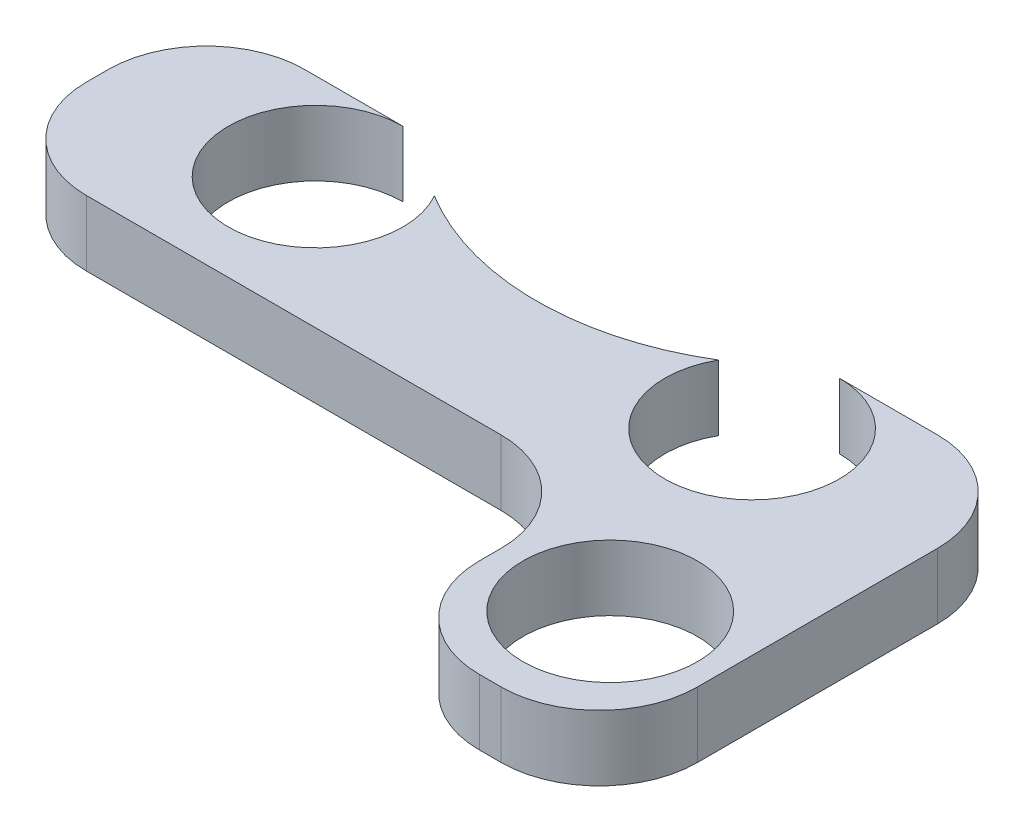
ISO-10303-21;
HEADER;
FILE_DESCRIPTION(('STEP AP214'),'2;1');
FILE_NAME('part.step','',(''),(''),'','','');
FILE_SCHEMA(('AUTOMOTIVE_DESIGN { 1 0 10303 214 1 1 1 1 }'));
ENDSEC;
DATA;
#1=APPLICATION_CONTEXT('core data for automotive mechanical design processes');
#2=APPLICATION_PROTOCOL_DEFINITION('international standard','automotive_design',2000,#1);
#3=PRODUCT_CONTEXT('',#1,'mechanical');
#4=PRODUCT('Part','Part','',(#3));
#5=PRODUCT_RELATED_PRODUCT_CATEGORY('part','',(#4));
#6=PRODUCT_DEFINITION_FORMATION('','',#4);
#7=PRODUCT_DEFINITION_CONTEXT('part definition',#1,'design');
#8=PRODUCT_DEFINITION('design','',#6,#7);
#9=PRODUCT_DEFINITION_SHAPE('','',#8);
#10=(LENGTH_UNIT() NAMED_UNIT(*) SI_UNIT(.MILLI.,.METRE.));
#11=(NAMED_UNIT(*) PLANE_ANGLE_UNIT() SI_UNIT($,.RADIAN.));
#12=(NAMED_UNIT(*) SI_UNIT($,.STERADIAN.) SOLID_ANGLE_UNIT());
#13=UNCERTAINTY_MEASURE_WITH_UNIT(LENGTH_MEASURE(1.E-05),#10,'distance_accuracy_value','');
#14=(GEOMETRIC_REPRESENTATION_CONTEXT(3) GLOBAL_UNCERTAINTY_ASSIGNED_CONTEXT((#13)) GLOBAL_UNIT_ASSIGNED_CONTEXT((#10,
#11,#12)) REPRESENTATION_CONTEXT('',''));
#15=CARTESIAN_POINT('',(0.,0.,0.));
#16=DIRECTION('',(0.,0.,1.));
#17=DIRECTION('',(1.,0.,0.));
#18=AXIS2_PLACEMENT_3D('',#15,#16,#17);
#19=CARTESIAN_POINT('',(-9.99999999999999,1.5,12.6244047484067));
#20=DIRECTION('',(0.,-1.,0.));
#21=DIRECTION('',(0.,0.,-1.));
#22=AXIS2_PLACEMENT_3D('',#19,#20,#21);
#23=PLANE('',#22);
#24=CARTESIAN_POINT('',(-9.99999999999999,1.5,12.6244047484067));
#25=DIRECTION('',(0.,-1.,0.));
#26=DIRECTION('',(0.,0.,-1.));
#27=AXIS2_PLACEMENT_3D('',#24,#25,#26);
#28=CIRCLE('',#27,4.);
#29=CARTESIAN_POINT('',(-6.50911973324603,1.5,10.6715209927295));
#30=VERTEX_POINT('',#29);
#31=CARTESIAN_POINT('',(-9.99999999999999,1.5,8.62440474840669));
#32=VERTEX_POINT('',#31);
#33=EDGE_CURVE('E212',#30,#32,#28,.T.);
#34=ORIENTED_EDGE('',*,*,#33,.T.);
#35=DIRECTION('',(-1.,0.,0.));
#36=VECTOR('',#35,1.);
#37=CARTESIAN_POINT('',(-9.99999999999999,1.5,8.62440474840669));
#38=LINE('',#37,#36);
#39=CARTESIAN_POINT('',(-14.5,1.5,8.62440474840669));
#40=VERTEX_POINT('',#39);
#41=EDGE_CURVE('E120',#32,#40,#38,.T.);
#42=ORIENTED_EDGE('',*,*,#41,.T.);
#43=CARTESIAN_POINT('',(-14.5,1.5,13.1244047484067));
#44=DIRECTION('',(0.,1.,0.));
#45=DIRECTION('',(0.,0.,1.));
#46=AXIS2_PLACEMENT_3D('',#43,#44,#45);
#47=CIRCLE('',#46,4.5);
#48=CARTESIAN_POINT('',(-19.,1.5,13.1244047484067));
#49=VERTEX_POINT('',#48);
#50=EDGE_CURVE('E251',#40,#49,#47,.T.);
#51=ORIENTED_EDGE('',*,*,#50,.T.);
#52=DIRECTION('',(0.,0.,1.));
#53=VECTOR('',#52,1.);
#54=CARTESIAN_POINT('',(-19.,1.5,13.1244047484067));
#55=LINE('',#54,#53);
#56=CARTESIAN_POINT('',(-19.,1.5,14.1244047484067));
#57=VERTEX_POINT('',#56);
#58=EDGE_CURVE('E270',#49,#57,#55,.T.);
#59=ORIENTED_EDGE('',*,*,#58,.T.);
#60=CARTESIAN_POINT('',(-14.5,1.5,14.1244047484067));
#61=DIRECTION('',(0.,1.,0.));
#62=DIRECTION('',(0.,0.,1.));
#63=AXIS2_PLACEMENT_3D('',#60,#61,#62);
#64=CIRCLE('',#63,4.5);
#65=CARTESIAN_POINT('',(-14.5,1.5,18.6244047484067));
#66=VERTEX_POINT('',#65);
#67=EDGE_CURVE('E267',#57,#66,#64,.T.);
#68=ORIENTED_EDGE('',*,*,#67,.T.);
#69=DIRECTION('',(1.,0.,0.));
#70=VECTOR('',#69,1.);
#71=CARTESIAN_POINT('',(-14.5,1.5,18.6244047484067));
#72=LINE('',#71,#70);
#73=CARTESIAN_POINT('',(4.5,1.5,18.6244047484067));
#74=VERTEX_POINT('',#73);
#75=EDGE_CURVE('E269',#66,#74,#72,.T.);
#76=ORIENTED_EDGE('',*,*,#75,.T.);
#77=CARTESIAN_POINT('',(4.5,1.5,23.1244047484067));
#78=DIRECTION('',(0.,-1.,0.));
#79=DIRECTION('',(0.,0.,1.));
#80=AXIS2_PLACEMENT_3D('',#77,#78,#79);
#81=CIRCLE('',#80,4.5);
#82=CARTESIAN_POINT('',(9.,1.5,23.1244047484067));
#83=VERTEX_POINT('',#82);
#84=EDGE_CURVE('E272',#74,#83,#81,.T.);
#85=ORIENTED_EDGE('',*,*,#84,.T.);
#86=DIRECTION('',(0.,0.,1.));
#87=VECTOR('',#86,1.);
#88=CARTESIAN_POINT('',(9.,1.5,23.1244047484067));
#89=LINE('',#88,#87);
#90=CARTESIAN_POINT('',(9.,1.5,24.1244047484067));
#91=VERTEX_POINT('',#90);
#92=EDGE_CURVE('E278',#83,#91,#89,.T.);
#93=ORIENTED_EDGE('',*,*,#92,.T.);
#94=CARTESIAN_POINT('',(13.5,1.5,24.1244047484067));
#95=DIRECTION('',(0.,1.,0.));
#96=DIRECTION('',(0.,0.,1.));
#97=AXIS2_PLACEMENT_3D('',#94,#95,#96);
#98=CIRCLE('',#97,4.5);
#99=CARTESIAN_POINT('',(13.5,1.5,28.6244047484067));
#100=VERTEX_POINT('',#99);
#101=EDGE_CURVE('E280',#91,#100,#98,.T.);
#102=ORIENTED_EDGE('',*,*,#101,.T.);
#103=DIRECTION('',(1.,0.,0.));
#104=VECTOR('',#103,1.);
#105=CARTESIAN_POINT('',(13.5,1.5,28.6244047484067));
#106=LINE('',#105,#104);
#107=CARTESIAN_POINT('',(14.5,1.5,28.6244047484067));
#108=VERTEX_POINT('',#107);
#109=EDGE_CURVE('E282',#100,#108,#106,.T.);
#110=ORIENTED_EDGE('',*,*,#109,.T.);
#111=CARTESIAN_POINT('',(14.5,1.5,24.1244047484067));
#112=DIRECTION('',(0.,1.,0.));
#113=DIRECTION('',(0.,0.,1.));
#114=AXIS2_PLACEMENT_3D('',#111,#112,#113);
#115=CIRCLE('',#114,4.5);
#116=CARTESIAN_POINT('',(19.,1.5,24.1244047484067));
#117=VERTEX_POINT('',#116);
#118=EDGE_CURVE('E284',#108,#117,#115,.T.);
#119=ORIENTED_EDGE('',*,*,#118,.T.);
#120=DIRECTION('',(0.,0.,-1.));
#121=VECTOR('',#120,1.);
#122=CARTESIAN_POINT('',(19.,1.5,24.1244047484067));
#123=LINE('',#122,#121);
#124=CARTESIAN_POINT('',(19.,1.5,13.1244047484067));
#125=VERTEX_POINT('',#124);
#126=EDGE_CURVE('E286',#117,#125,#123,.T.);
#127=ORIENTED_EDGE('',*,*,#126,.T.);
#128=CARTESIAN_POINT('',(14.5,1.5,13.1244047484067));
#129=DIRECTION('',(0.,1.,0.));
#130=DIRECTION('',(0.,0.,-1.));
#131=AXIS2_PLACEMENT_3D('',#128,#129,#130);
#132=CIRCLE('',#131,4.5);
#133=CARTESIAN_POINT('',(14.5,1.5,8.62440474840669));
#134=VERTEX_POINT('',#133);
#135=EDGE_CURVE('E163',#125,#134,#132,.T.);
#136=ORIENTED_EDGE('',*,*,#135,.T.);
#137=DIRECTION('',(-1.,0.,0.));
#138=VECTOR('',#137,1.);
#139=CARTESIAN_POINT('',(14.5,1.5,8.62440474840669));
#140=LINE('',#139,#138);
#141=CARTESIAN_POINT('',(10.,1.5,8.62440474840669));
#142=VERTEX_POINT('',#141);
#143=EDGE_CURVE('E157',#134,#142,#140,.T.);
#144=ORIENTED_EDGE('',*,*,#143,.T.);
#145=CARTESIAN_POINT('',(10.,1.5,12.6244047484067));
#146=DIRECTION('',(0.,-1.,0.));
#147=DIRECTION('',(0.,0.,1.));
#148=AXIS2_PLACEMENT_3D('',#145,#146,#147);
#149=CIRCLE('',#148,4.);
#150=CARTESIAN_POINT('',(6.50911973324603,1.5,10.6715209927295));
#151=VERTEX_POINT('',#150);
#152=EDGE_CURVE('E161',#142,#151,#149,.T.);
#153=ORIENTED_EDGE('',*,*,#152,.T.);
#154=CARTESIAN_POINT('',(0.,1.5,0.));
#155=DIRECTION('',(0.,-1.,0.));
#156=DIRECTION('',(0.,0.,1.));
#157=AXIS2_PLACEMENT_3D('',#154,#155,#156);
#158=CIRCLE('',#157,12.5);
#159=EDGE_CURVE('E53',#151,#30,#158,.T.);
#160=ORIENTED_EDGE('',*,*,#159,.T.);
#161=EDGE_LOOP('',(#34,#42,#51,#59,#68,#76,#85,#93,#102,#110,#119,#127,#136,#144,#153,#160));
#162=FACE_BOUND('',#161,.T.);
#163=CARTESIAN_POINT('',(14.,1.5,23.1244047484067));
#164=DIRECTION('',(0.,1.,0.));
#165=DIRECTION('',(0.,0.,1.));
#166=AXIS2_PLACEMENT_3D('',#163,#164,#165);
#167=CIRCLE('',#166,4.);
#168=CARTESIAN_POINT('',(14.,1.5,27.1244047484067));
#169=VERTEX_POINT('',#168);
#170=EDGE_CURVE('E185',#169,#169,#167,.T.);
#171=ORIENTED_EDGE('',*,*,#170,.F.);
#172=EDGE_LOOP('',(#171));
#173=FACE_BOUND('',#172,.T.);
#174=ADVANCED_FACE('F36',(#162,#173),#23,.F.);
#175=CARTESIAN_POINT('',(-9.99999999999999,-1.5,12.6244047484067));
#176=DIRECTION('',(0.,-1.,0.));
#177=DIRECTION('',(0.,0.,-1.));
#178=AXIS2_PLACEMENT_3D('',#175,#176,#177);
#179=PLANE('',#178);
#180=CARTESIAN_POINT('',(-9.99999999999999,-1.5,12.6244047484067));
#181=DIRECTION('',(0.,-1.,0.));
#182=DIRECTION('',(0.,0.,-1.));
#183=AXIS2_PLACEMENT_3D('',#180,#181,#182);
#184=CIRCLE('',#183,4.);
#185=CARTESIAN_POINT('',(-6.50911973324603,-1.5,10.6715209927295));
#186=VERTEX_POINT('',#185);
#187=CARTESIAN_POINT('',(-9.99999999999999,-1.5,8.62440474840669));
#188=VERTEX_POINT('',#187);
#189=EDGE_CURVE('E181',#186,#188,#184,.T.);
#190=ORIENTED_EDGE('',*,*,#189,.F.);
#191=CARTESIAN_POINT('',(0.,-1.5,0.));
#192=DIRECTION('',(0.,-1.,0.));
#193=DIRECTION('',(0.,0.,1.));
#194=AXIS2_PLACEMENT_3D('',#191,#192,#193);
#195=CIRCLE('',#194,12.5);
#196=CARTESIAN_POINT('',(6.50911973324603,-1.5,10.6715209927295));
#197=VERTEX_POINT('',#196);
#198=EDGE_CURVE('E112',#197,#186,#195,.T.);
#199=ORIENTED_EDGE('',*,*,#198,.F.);
#200=CARTESIAN_POINT('',(10.,-1.5,12.6244047484067));
#201=DIRECTION('',(0.,-1.,0.));
#202=DIRECTION('',(0.,0.,1.));
#203=AXIS2_PLACEMENT_3D('',#200,#201,#202);
#204=CIRCLE('',#203,4.);
#205=CARTESIAN_POINT('',(10.,-1.5,8.62440474840669));
#206=VERTEX_POINT('',#205);
#207=EDGE_CURVE('E106',#206,#197,#204,.T.);
#208=ORIENTED_EDGE('',*,*,#207,.F.);
#209=DIRECTION('',(-1.,0.,0.));
#210=VECTOR('',#209,1.);
#211=CARTESIAN_POINT('',(14.5,-1.5,8.62440474840669));
#212=LINE('',#211,#210);
#213=CARTESIAN_POINT('',(14.5,-1.5,8.62440474840669));
#214=VERTEX_POINT('',#213);
#215=EDGE_CURVE('E171',#214,#206,#212,.T.);
#216=ORIENTED_EDGE('',*,*,#215,.F.);
#217=CARTESIAN_POINT('',(14.5,-1.5,13.1244047484067));
#218=DIRECTION('',(0.,1.,0.));
#219=DIRECTION('',(0.,0.,-1.));
#220=AXIS2_PLACEMENT_3D('',#217,#218,#219);
#221=CIRCLE('',#220,4.5);
#222=CARTESIAN_POINT('',(19.,-1.5,13.1244047484067));
#223=VERTEX_POINT('',#222);
#224=EDGE_CURVE('E207',#223,#214,#221,.T.);
#225=ORIENTED_EDGE('',*,*,#224,.F.);
#226=DIRECTION('',(0.,0.,-1.));
#227=VECTOR('',#226,1.);
#228=CARTESIAN_POINT('',(19.,-1.5,24.1244047484067));
#229=LINE('',#228,#227);
#230=CARTESIAN_POINT('',(19.,-1.5,24.1244047484067));
#231=VERTEX_POINT('',#230);
#232=EDGE_CURVE('E205',#231,#223,#229,.T.);
#233=ORIENTED_EDGE('',*,*,#232,.F.);
#234=CARTESIAN_POINT('',(14.5,-1.5,24.1244047484067));
#235=DIRECTION('',(0.,1.,0.));
#236=DIRECTION('',(0.,0.,1.));
#237=AXIS2_PLACEMENT_3D('',#234,#235,#236);
#238=CIRCLE('',#237,4.5);
#239=CARTESIAN_POINT('',(14.5,-1.5,28.6244047484067));
#240=VERTEX_POINT('',#239);
#241=EDGE_CURVE('E203',#240,#231,#238,.T.);
#242=ORIENTED_EDGE('',*,*,#241,.F.);
#243=DIRECTION('',(1.,0.,0.));
#244=VECTOR('',#243,1.);
#245=CARTESIAN_POINT('',(13.5,-1.5,28.6244047484067));
#246=LINE('',#245,#244);
#247=CARTESIAN_POINT('',(13.5,-1.5,28.6244047484067));
#248=VERTEX_POINT('',#247);
#249=EDGE_CURVE('E201',#248,#240,#246,.T.);
#250=ORIENTED_EDGE('',*,*,#249,.F.);
#251=CARTESIAN_POINT('',(13.5,-1.5,24.1244047484067));
#252=DIRECTION('',(0.,1.,0.));
#253=DIRECTION('',(0.,0.,1.));
#254=AXIS2_PLACEMENT_3D('',#251,#252,#253);
#255=CIRCLE('',#254,4.5);
#256=CARTESIAN_POINT('',(9.,-1.5,24.1244047484067));
#257=VERTEX_POINT('',#256);
#258=EDGE_CURVE('E199',#257,#248,#255,.T.);
#259=ORIENTED_EDGE('',*,*,#258,.F.);
#260=DIRECTION('',(0.,0.,1.));
#261=VECTOR('',#260,1.);
#262=CARTESIAN_POINT('',(9.,-1.5,23.1244047484067));
#263=LINE('',#262,#261);
#264=CARTESIAN_POINT('',(9.,-1.5,23.1244047484067));
#265=VERTEX_POINT('',#264);
#266=EDGE_CURVE('E197',#265,#257,#263,.T.);
#267=ORIENTED_EDGE('',*,*,#266,.F.);
#268=CARTESIAN_POINT('',(4.5,-1.5,23.1244047484067));
#269=DIRECTION('',(0.,-1.,0.));
#270=DIRECTION('',(0.,0.,1.));
#271=AXIS2_PLACEMENT_3D('',#268,#269,#270);
#272=CIRCLE('',#271,4.5);
#273=CARTESIAN_POINT('',(4.5,-1.5,18.6244047484067));
#274=VERTEX_POINT('',#273);
#275=EDGE_CURVE('E195',#274,#265,#272,.T.);
#276=ORIENTED_EDGE('',*,*,#275,.F.);
#277=DIRECTION('',(1.,0.,0.));
#278=VECTOR('',#277,1.);
#279=CARTESIAN_POINT('',(-14.5,-1.5,18.6244047484067));
#280=LINE('',#279,#278);
#281=CARTESIAN_POINT('',(-14.5,-1.5,18.6244047484067));
#282=VERTEX_POINT('',#281);
#283=EDGE_CURVE('E193',#282,#274,#280,.T.);
#284=ORIENTED_EDGE('',*,*,#283,.F.);
#285=CARTESIAN_POINT('',(-14.5,-1.5,14.1244047484067));
#286=DIRECTION('',(0.,1.,0.));
#287=DIRECTION('',(0.,0.,1.));
#288=AXIS2_PLACEMENT_3D('',#285,#286,#287);
#289=CIRCLE('',#288,4.5);
#290=CARTESIAN_POINT('',(-19.,-1.5,14.1244047484067));
#291=VERTEX_POINT('',#290);
#292=EDGE_CURVE('E191',#291,#282,#289,.T.);
#293=ORIENTED_EDGE('',*,*,#292,.F.);
#294=DIRECTION('',(0.,0.,1.));
#295=VECTOR('',#294,1.);
#296=CARTESIAN_POINT('',(-19.,-1.5,13.1244047484067));
#297=LINE('',#296,#295);
#298=CARTESIAN_POINT('',(-19.,-1.5,13.1244047484067));
#299=VERTEX_POINT('',#298);
#300=EDGE_CURVE('E189',#299,#291,#297,.T.);
#301=ORIENTED_EDGE('',*,*,#300,.F.);
#302=CARTESIAN_POINT('',(-14.5,-1.5,13.1244047484067));
#303=DIRECTION('',(0.,1.,0.));
#304=DIRECTION('',(0.,0.,1.));
#305=AXIS2_PLACEMENT_3D('',#302,#303,#304);
#306=CIRCLE('',#305,4.5);
#307=CARTESIAN_POINT('',(-14.5,-1.5,8.62440474840669));
#308=VERTEX_POINT('',#307);
#309=EDGE_CURVE('E187',#308,#299,#306,.T.);
#310=ORIENTED_EDGE('',*,*,#309,.F.);
#311=DIRECTION('',(-1.,0.,0.));
#312=VECTOR('',#311,1.);
#313=CARTESIAN_POINT('',(-9.99999999999999,-1.5,8.62440474840669));
#314=LINE('',#313,#312);
#315=EDGE_CURVE('E184',#188,#308,#314,.T.);
#316=ORIENTED_EDGE('',*,*,#315,.F.);
#317=EDGE_LOOP('',(#190,#199,#208,#216,#225,#233,#242,#250,#259,#267,#276,#284,#293,#301,#310,#316));
#318=FACE_BOUND('',#317,.T.);
#319=CARTESIAN_POINT('',(14.,-1.5,23.1244047484067));
#320=DIRECTION('',(0.,1.,0.));
#321=DIRECTION('',(0.,0.,1.));
#322=AXIS2_PLACEMENT_3D('',#319,#320,#321);
#323=CIRCLE('',#322,4.);
#324=CARTESIAN_POINT('',(14.,-1.5,27.1244047484067));
#325=VERTEX_POINT('',#324);
#326=EDGE_CURVE('E485',#325,#325,#323,.T.);
#327=ORIENTED_EDGE('',*,*,#326,.T.);
#328=EDGE_LOOP('',(#327));
#329=FACE_BOUND('',#328,.T.);
#330=ADVANCED_FACE('F255',(#318,#329),#179,.T.);
#331=CARTESIAN_POINT('',(-9.99999999999999,1.5,12.6244047484067));
#332=DIRECTION('',(0.,-1.,0.));
#333=DIRECTION('',(0.,0.,-1.));
#334=AXIS2_PLACEMENT_3D('',#331,#332,#333);
#335=CYLINDRICAL_SURFACE('',#334,4.);
#336=ORIENTED_EDGE('',*,*,#189,.T.);
#337=DIRECTION('',(0.,-1.,0.));
#338=VECTOR('',#337,1.);
#339=CARTESIAN_POINT('',(-9.99999999999999,1.5,8.62440474840669));
#340=LINE('',#339,#338);
#341=EDGE_CURVE('E11',#32,#188,#340,.T.);
#342=ORIENTED_EDGE('',*,*,#341,.F.);
#343=ORIENTED_EDGE('',*,*,#33,.F.);
#344=DIRECTION('',(0.,-1.,0.));
#345=VECTOR('',#344,1.);
#346=CARTESIAN_POINT('',(-6.50911973324603,1.5,10.6715209927295));
#347=LINE('',#346,#345);
#348=EDGE_CURVE('E177',#30,#186,#347,.T.);
#349=ORIENTED_EDGE('',*,*,#348,.T.);
#350=EDGE_LOOP('',(#336,#342,#343,#349));
#351=FACE_BOUND('',#350,.T.);
#352=ADVANCED_FACE('F38',(#351),#335,.F.);
#353=CARTESIAN_POINT('',(-9.99999999999999,1.5,8.62440474840669));
#354=DIRECTION('',(0.,0.,1.));
#355=DIRECTION('',(1.,0.,0.));
#356=AXIS2_PLACEMENT_3D('',#353,#354,#355);
#357=PLANE('',#356);
#358=ORIENTED_EDGE('',*,*,#315,.T.);
#359=DIRECTION('',(0.,-1.,0.));
#360=VECTOR('',#359,1.);
#361=CARTESIAN_POINT('',(-14.5,1.5,8.62440474840669));
#362=LINE('',#361,#360);
#363=EDGE_CURVE('E45',#40,#308,#362,.T.);
#364=ORIENTED_EDGE('',*,*,#363,.F.);
#365=ORIENTED_EDGE('',*,*,#41,.F.);
#366=ORIENTED_EDGE('',*,*,#341,.T.);
#367=EDGE_LOOP('',(#358,#364,#365,#366));
#368=FACE_BOUND('',#367,.T.);
#369=ADVANCED_FACE('F320',(#368),#357,.F.);
#370=CARTESIAN_POINT('',(-14.5,1.5,13.1244047484067));
#371=DIRECTION('',(0.,-1.,0.));
#372=DIRECTION('',(0.,0.,-1.));
#373=AXIS2_PLACEMENT_3D('',#370,#371,#372);
#374=CYLINDRICAL_SURFACE('',#373,4.5);
#375=ORIENTED_EDGE('',*,*,#309,.T.);
#376=DIRECTION('',(0.,-1.,0.));
#377=VECTOR('',#376,1.);
#378=CARTESIAN_POINT('',(-19.,1.5,13.1244047484067));
#379=LINE('',#378,#377);
#380=EDGE_CURVE('E243',#49,#299,#379,.T.);
#381=ORIENTED_EDGE('',*,*,#380,.F.);
#382=ORIENTED_EDGE('',*,*,#50,.F.);
#383=ORIENTED_EDGE('',*,*,#363,.T.);
#384=EDGE_LOOP('',(#375,#381,#382,#383));
#385=FACE_BOUND('',#384,.T.);
#386=ADVANCED_FACE('F249',(#385),#374,.T.);
#387=CARTESIAN_POINT('',(-19.,1.5,13.1244047484067));
#388=DIRECTION('',(1.,0.,0.));
#389=DIRECTION('',(0.,0.,-1.));
#390=AXIS2_PLACEMENT_3D('',#387,#388,#389);
#391=PLANE('',#390);
#392=ORIENTED_EDGE('',*,*,#300,.T.);
#393=DIRECTION('',(0.,-1.,0.));
#394=VECTOR('',#393,1.);
#395=CARTESIAN_POINT('',(-19.,1.5,14.1244047484067));
#396=LINE('',#395,#394);
#397=EDGE_CURVE('E240',#57,#291,#396,.T.);
#398=ORIENTED_EDGE('',*,*,#397,.F.);
#399=ORIENTED_EDGE('',*,*,#58,.F.);
#400=ORIENTED_EDGE('',*,*,#380,.T.);
#401=EDGE_LOOP('',(#392,#398,#399,#400));
#402=FACE_BOUND('',#401,.T.);
#403=ADVANCED_FACE('F261',(#402),#391,.F.);
#404=CARTESIAN_POINT('',(-14.5,1.5,14.1244047484067));
#405=DIRECTION('',(0.,-1.,0.));
#406=DIRECTION('',(0.,0.,-1.));
#407=AXIS2_PLACEMENT_3D('',#404,#405,#406);
#408=CYLINDRICAL_SURFACE('',#407,4.5);
#409=ORIENTED_EDGE('',*,*,#292,.T.);
#410=DIRECTION('',(0.,-1.,0.));
#411=VECTOR('',#410,1.);
#412=CARTESIAN_POINT('',(-14.5,1.5,18.6244047484067));
#413=LINE('',#412,#411);
#414=EDGE_CURVE('E237',#66,#282,#413,.T.);
#415=ORIENTED_EDGE('',*,*,#414,.F.);
#416=ORIENTED_EDGE('',*,*,#67,.F.);
#417=ORIENTED_EDGE('',*,*,#397,.T.);
#418=EDGE_LOOP('',(#409,#415,#416,#417));
#419=FACE_BOUND('',#418,.T.);
#420=ADVANCED_FACE('F265',(#419),#408,.T.);
#421=CARTESIAN_POINT('',(-14.5,1.5,18.6244047484067));
#422=DIRECTION('',(0.,0.,-1.));
#423=DIRECTION('',(-1.,0.,0.));
#424=AXIS2_PLACEMENT_3D('',#421,#422,#423);
#425=PLANE('',#424);
#426=ORIENTED_EDGE('',*,*,#283,.T.);
#427=DIRECTION('',(0.,-1.,0.));
#428=VECTOR('',#427,1.);
#429=CARTESIAN_POINT('',(4.5,1.5,18.6244047484067));
#430=LINE('',#429,#428);
#431=EDGE_CURVE('E234',#74,#274,#430,.T.);
#432=ORIENTED_EDGE('',*,*,#431,.F.);
#433=ORIENTED_EDGE('',*,*,#75,.F.);
#434=ORIENTED_EDGE('',*,*,#414,.T.);
#435=EDGE_LOOP('',(#426,#432,#433,#434));
#436=FACE_BOUND('',#435,.T.);
#437=ADVANCED_FACE('F333',(#436),#425,.F.);
#438=CARTESIAN_POINT('',(4.5,1.5,23.1244047484067));
#439=DIRECTION('',(0.,-1.,0.));
#440=DIRECTION('',(0.,0.,-1.));
#441=AXIS2_PLACEMENT_3D('',#438,#439,#440);
#442=CYLINDRICAL_SURFACE('',#441,4.5);
#443=ORIENTED_EDGE('',*,*,#275,.T.);
#444=DIRECTION('',(0.,-1.,0.));
#445=VECTOR('',#444,1.);
#446=CARTESIAN_POINT('',(9.,1.5,23.1244047484067));
#447=LINE('',#446,#445);
#448=EDGE_CURVE('E231',#83,#265,#447,.T.);
#449=ORIENTED_EDGE('',*,*,#448,.F.);
#450=ORIENTED_EDGE('',*,*,#84,.F.);
#451=ORIENTED_EDGE('',*,*,#431,.T.);
#452=EDGE_LOOP('',(#443,#449,#450,#451));
#453=FACE_BOUND('',#452,.T.);
#454=ADVANCED_FACE('F336',(#453),#442,.F.);
#455=CARTESIAN_POINT('',(9.,1.5,23.1244047484067));
#456=DIRECTION('',(1.,0.,0.));
#457=DIRECTION('',(0.,0.,-1.));
#458=AXIS2_PLACEMENT_3D('',#455,#456,#457);
#459=PLANE('',#458);
#460=ORIENTED_EDGE('',*,*,#266,.T.);
#461=DIRECTION('',(0.,-1.,0.));
#462=VECTOR('',#461,1.);
#463=CARTESIAN_POINT('',(9.,1.5,24.1244047484067));
#464=LINE('',#463,#462);
#465=EDGE_CURVE('E228',#91,#257,#464,.T.);
#466=ORIENTED_EDGE('',*,*,#465,.F.);
#467=ORIENTED_EDGE('',*,*,#92,.F.);
#468=ORIENTED_EDGE('',*,*,#448,.T.);
#469=EDGE_LOOP('',(#460,#466,#467,#468));
#470=FACE_BOUND('',#469,.T.);
#471=ADVANCED_FACE('F340',(#470),#459,.F.);
#472=CARTESIAN_POINT('',(13.5,1.5,24.1244047484067));
#473=DIRECTION('',(0.,-1.,0.));
#474=DIRECTION('',(0.,0.,-1.));
#475=AXIS2_PLACEMENT_3D('',#472,#473,#474);
#476=CYLINDRICAL_SURFACE('',#475,4.5);
#477=ORIENTED_EDGE('',*,*,#258,.T.);
#478=DIRECTION('',(0.,-1.,0.));
#479=VECTOR('',#478,1.);
#480=CARTESIAN_POINT('',(13.5,1.5,28.6244047484067));
#481=LINE('',#480,#479);
#482=EDGE_CURVE('E225',#100,#248,#481,.T.);
#483=ORIENTED_EDGE('',*,*,#482,.F.);
#484=ORIENTED_EDGE('',*,*,#101,.F.);
#485=ORIENTED_EDGE('',*,*,#465,.T.);
#486=EDGE_LOOP('',(#477,#483,#484,#485));
#487=FACE_BOUND('',#486,.T.);
#488=ADVANCED_FACE('F344',(#487),#476,.T.);
#489=CARTESIAN_POINT('',(13.5,1.5,28.6244047484067));
#490=DIRECTION('',(0.,0.,-1.));
#491=DIRECTION('',(-1.,0.,0.));
#492=AXIS2_PLACEMENT_3D('',#489,#490,#491);
#493=PLANE('',#492);
#494=ORIENTED_EDGE('',*,*,#249,.T.);
#495=DIRECTION('',(0.,-1.,0.));
#496=VECTOR('',#495,1.);
#497=CARTESIAN_POINT('',(14.5,1.5,28.6244047484067));
#498=LINE('',#497,#496);
#499=EDGE_CURVE('E222',#108,#240,#498,.T.);
#500=ORIENTED_EDGE('',*,*,#499,.F.);
#501=ORIENTED_EDGE('',*,*,#109,.F.);
#502=ORIENTED_EDGE('',*,*,#482,.T.);
#503=EDGE_LOOP('',(#494,#500,#501,#502));
#504=FACE_BOUND('',#503,.T.);
#505=ADVANCED_FACE('F348',(#504),#493,.F.);
#506=CARTESIAN_POINT('',(14.5,1.5,24.1244047484067));
#507=DIRECTION('',(0.,-1.,0.));
#508=DIRECTION('',(0.,0.,-1.));
#509=AXIS2_PLACEMENT_3D('',#506,#507,#508);
#510=CYLINDRICAL_SURFACE('',#509,4.5);
#511=ORIENTED_EDGE('',*,*,#241,.T.);
#512=DIRECTION('',(0.,-1.,0.));
#513=VECTOR('',#512,1.);
#514=CARTESIAN_POINT('',(19.,1.5,24.1244047484067));
#515=LINE('',#514,#513);
#516=EDGE_CURVE('E219',#117,#231,#515,.T.);
#517=ORIENTED_EDGE('',*,*,#516,.F.);
#518=ORIENTED_EDGE('',*,*,#118,.F.);
#519=ORIENTED_EDGE('',*,*,#499,.T.);
#520=EDGE_LOOP('',(#511,#517,#518,#519));
#521=FACE_BOUND('',#520,.T.);
#522=ADVANCED_FACE('F352',(#521),#510,.T.);
#523=CARTESIAN_POINT('',(19.,1.5,24.1244047484067));
#524=DIRECTION('',(-1.,0.,0.));
#525=DIRECTION('',(0.,0.,1.));
#526=AXIS2_PLACEMENT_3D('',#523,#524,#525);
#527=PLANE('',#526);
#528=ORIENTED_EDGE('',*,*,#232,.T.);
#529=DIRECTION('',(0.,-1.,0.));
#530=VECTOR('',#529,1.);
#531=CARTESIAN_POINT('',(19.,1.5,13.1244047484067));
#532=LINE('',#531,#530);
#533=EDGE_CURVE('E216',#125,#223,#532,.T.);
#534=ORIENTED_EDGE('',*,*,#533,.F.);
#535=ORIENTED_EDGE('',*,*,#126,.F.);
#536=ORIENTED_EDGE('',*,*,#516,.T.);
#537=EDGE_LOOP('',(#528,#534,#535,#536));
#538=FACE_BOUND('',#537,.T.);
#539=ADVANCED_FACE('F292',(#538),#527,.F.);
#540=CARTESIAN_POINT('',(14.5,1.5,13.1244047484067));
#541=DIRECTION('',(0.,-1.,0.));
#542=DIRECTION('',(0.,0.,-1.));
#543=AXIS2_PLACEMENT_3D('',#540,#541,#542);
#544=CYLINDRICAL_SURFACE('',#543,4.5);
#545=ORIENTED_EDGE('',*,*,#224,.T.);
#546=DIRECTION('',(0.,-1.,0.));
#547=VECTOR('',#546,1.);
#548=CARTESIAN_POINT('',(14.5,1.5,8.62440474840669));
#549=LINE('',#548,#547);
#550=EDGE_CURVE('E172',#134,#214,#549,.T.);
#551=ORIENTED_EDGE('',*,*,#550,.F.);
#552=ORIENTED_EDGE('',*,*,#135,.F.);
#553=ORIENTED_EDGE('',*,*,#533,.T.);
#554=EDGE_LOOP('',(#545,#551,#552,#553));
#555=FACE_BOUND('',#554,.T.);
#556=ADVANCED_FACE('F296',(#555),#544,.T.);
#557=CARTESIAN_POINT('',(14.5,1.5,8.62440474840669));
#558=DIRECTION('',(0.,0.,1.));
#559=DIRECTION('',(1.,0.,0.));
#560=AXIS2_PLACEMENT_3D('',#557,#558,#559);
#561=PLANE('',#560);
#562=ORIENTED_EDGE('',*,*,#215,.T.);
#563=DIRECTION('',(0.,-1.,0.));
#564=VECTOR('',#563,1.);
#565=CARTESIAN_POINT('',(10.,1.5,8.62440474840669));
#566=LINE('',#565,#564);
#567=EDGE_CURVE('E168',#142,#206,#566,.T.);
#568=ORIENTED_EDGE('',*,*,#567,.F.);
#569=ORIENTED_EDGE('',*,*,#143,.F.);
#570=ORIENTED_EDGE('',*,*,#550,.T.);
#571=EDGE_LOOP('',(#562,#568,#569,#570));
#572=FACE_BOUND('',#571,.T.);
#573=ADVANCED_FACE('F169',(#572),#561,.F.);
#574=CARTESIAN_POINT('',(10.,1.5,12.6244047484067));
#575=DIRECTION('',(0.,-1.,0.));
#576=DIRECTION('',(0.,0.,-1.));
#577=AXIS2_PLACEMENT_3D('',#574,#575,#576);
#578=CYLINDRICAL_SURFACE('',#577,4.);
#579=ORIENTED_EDGE('',*,*,#207,.T.);
#580=DIRECTION('',(0.,-1.,0.));
#581=VECTOR('',#580,1.);
#582=CARTESIAN_POINT('',(6.50911973324603,1.5,10.6715209927295));
#583=LINE('',#582,#581);
#584=EDGE_CURVE('E173',#151,#197,#583,.T.);
#585=ORIENTED_EDGE('',*,*,#584,.F.);
#586=ORIENTED_EDGE('',*,*,#152,.F.);
#587=ORIENTED_EDGE('',*,*,#567,.T.);
#588=EDGE_LOOP('',(#579,#585,#586,#587));
#589=FACE_BOUND('',#588,.T.);
#590=ADVANCED_FACE('F175',(#589),#578,.F.);
#591=CARTESIAN_POINT('',(0.,1.5,0.));
#592=DIRECTION('',(0.,-1.,0.));
#593=DIRECTION('',(0.,0.,-1.));
#594=AXIS2_PLACEMENT_3D('',#591,#592,#593);
#595=CYLINDRICAL_SURFACE('',#594,12.5);
#596=ORIENTED_EDGE('',*,*,#198,.T.);
#597=ORIENTED_EDGE('',*,*,#348,.F.);
#598=ORIENTED_EDGE('',*,*,#159,.F.);
#599=ORIENTED_EDGE('',*,*,#584,.T.);
#600=EDGE_LOOP('',(#596,#597,#598,#599));
#601=FACE_BOUND('',#600,.T.);
#602=ADVANCED_FACE('F300',(#601),#595,.F.);
#603=CARTESIAN_POINT('',(14.,1.5,23.1244047484067));
#604=DIRECTION('',(0.,-1.,0.));
#605=DIRECTION('',(0.,0.,-1.));
#606=AXIS2_PLACEMENT_3D('',#603,#604,#605);
#607=CYLINDRICAL_SURFACE('',#606,4.);
#608=ORIENTED_EDGE('',*,*,#170,.T.);
#609=EDGE_LOOP('',(#608));
#610=FACE_BOUND('',#609,.T.);
#611=ORIENTED_EDGE('',*,*,#326,.F.);
#612=EDGE_LOOP('',(#611));
#613=FACE_BOUND('',#612,.T.);
#614=ADVANCED_FACE('F302',(#610,#613),#607,.F.);
#615=CLOSED_SHELL('',(#174,#330,#352,#369,#386,#403,#420,#437,#454,#471,#488,#505,#522,#539,
#556,#573,#590,#602,#614));
#616=MANIFOLD_SOLID_BREP('B2',#615);
#617=ADVANCED_BREP_SHAPE_REPRESENTATION('',(#18,#616),#14);
#618=SHAPE_DEFINITION_REPRESENTATION(#9,#617);
ENDSEC;
END-ISO-10303-21;
